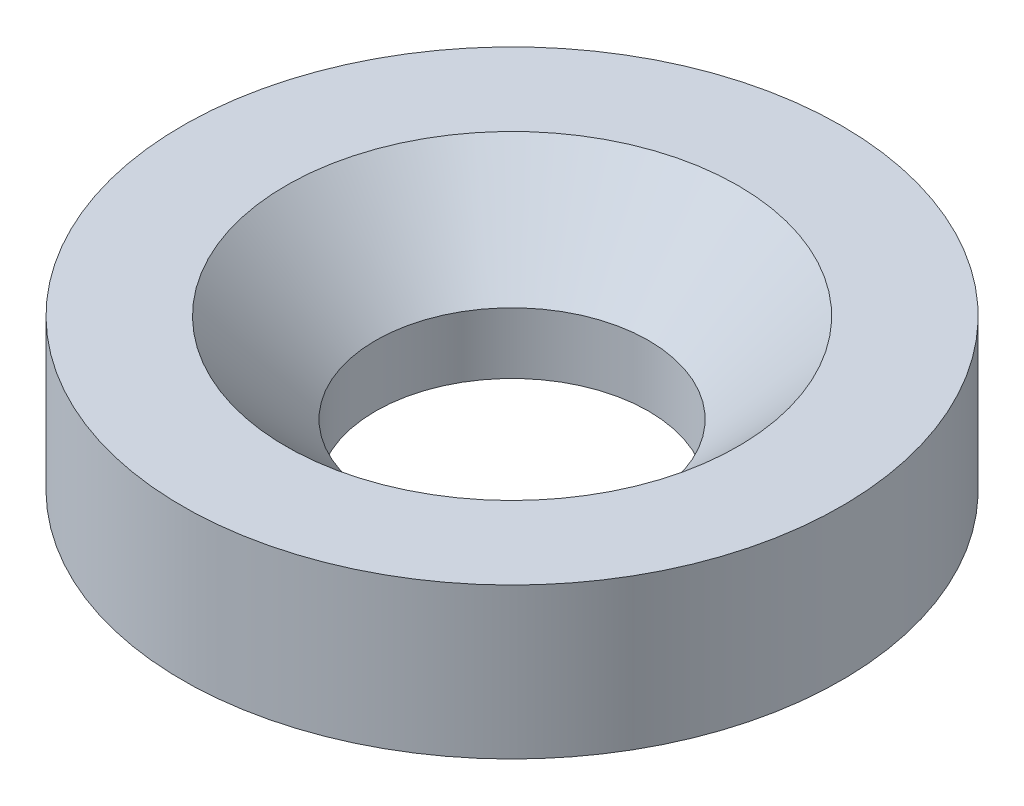
ISO-10303-21;
HEADER;
FILE_DESCRIPTION(('STEP AP214'),'2;1');
FILE_NAME('part.step','',(''),(''),'','','');
FILE_SCHEMA(('AUTOMOTIVE_DESIGN { 1 0 10303 214 1 1 1 1 }'));
ENDSEC;
DATA;
#1=APPLICATION_CONTEXT('core data for automotive mechanical design processes');
#2=APPLICATION_PROTOCOL_DEFINITION('international standard','automotive_design',2000,#1);
#3=PRODUCT_CONTEXT('',#1,'mechanical');
#4=PRODUCT('Part','Part','',(#3));
#5=PRODUCT_RELATED_PRODUCT_CATEGORY('part','',(#4));
#6=PRODUCT_DEFINITION_FORMATION('','',#4);
#7=PRODUCT_DEFINITION_CONTEXT('part definition',#1,'design');
#8=PRODUCT_DEFINITION('design','',#6,#7);
#9=PRODUCT_DEFINITION_SHAPE('','',#8);
#10=(LENGTH_UNIT() NAMED_UNIT(*) SI_UNIT(.MILLI.,.METRE.));
#11=(NAMED_UNIT(*) PLANE_ANGLE_UNIT() SI_UNIT($,.RADIAN.));
#12=(NAMED_UNIT(*) SI_UNIT($,.STERADIAN.) SOLID_ANGLE_UNIT());
#13=UNCERTAINTY_MEASURE_WITH_UNIT(LENGTH_MEASURE(1.E-05),#10,'distance_accuracy_value','');
#14=(GEOMETRIC_REPRESENTATION_CONTEXT(3) GLOBAL_UNCERTAINTY_ASSIGNED_CONTEXT((#13)) GLOBAL_UNIT_ASSIGNED_CONTEXT((#10,
#11,#12)) REPRESENTATION_CONTEXT('',''));
#15=CARTESIAN_POINT('',(0.,0.,0.));
#16=DIRECTION('',(0.,0.,1.));
#17=DIRECTION('',(1.,0.,0.));
#18=AXIS2_PLACEMENT_3D('',#15,#16,#17);
#19=CARTESIAN_POINT('',(0.,0.,0.));
#20=DIRECTION('',(0.,-1.,0.));
#21=DIRECTION('',(0.,0.,-1.));
#22=AXIS2_PLACEMENT_3D('',#19,#20,#21);
#23=CYLINDRICAL_SURFACE('',#22,7.25);
#24=CARTESIAN_POINT('',(0.,0.,0.));
#25=DIRECTION('',(0.,-1.,0.));
#26=DIRECTION('',(0.,0.,-1.));
#27=AXIS2_PLACEMENT_3D('',#24,#25,#26);
#28=CIRCLE('',#27,7.25);
#29=CARTESIAN_POINT('',(0.,0.,-7.25));
#30=VERTEX_POINT('',#29);
#31=EDGE_CURVE('E10',#30,#30,#28,.T.);
#32=ORIENTED_EDGE('',*,*,#31,.T.);
#33=EDGE_LOOP('',(#32));
#34=FACE_BOUND('',#33,.T.);
#35=CARTESIAN_POINT('',(0.,3.24999999999995,0.));
#36=DIRECTION('',(0.,-1.,0.));
#37=DIRECTION('',(0.,0.,-1.));
#38=AXIS2_PLACEMENT_3D('',#35,#36,#37);
#39=CIRCLE('',#38,7.25);
#40=CARTESIAN_POINT('',(0.,3.24999999999995,-7.25));
#41=VERTEX_POINT('',#40);
#42=EDGE_CURVE('E60',#41,#41,#39,.T.);
#43=ORIENTED_EDGE('',*,*,#42,.F.);
#44=EDGE_LOOP('',(#43));
#45=FACE_BOUND('',#44,.T.);
#46=ADVANCED_FACE('F37',(#34,#45),#23,.F.);
#47=CARTESIAN_POINT('',(7.25,0.,0.));
#48=DIRECTION('',(0.,-1.,0.));
#49=DIRECTION('',(0.,0.,-1.));
#50=AXIS2_PLACEMENT_3D('',#47,#48,#49);
#51=PLANE('',#50);
#52=CARTESIAN_POINT('',(0.,0.,0.));
#53=DIRECTION('',(0.,-1.,0.));
#54=DIRECTION('',(0.,0.,-1.));
#55=AXIS2_PLACEMENT_3D('',#52,#53,#54);
#56=CIRCLE('',#55,17.5);
#57=CARTESIAN_POINT('',(0.,0.,-17.5));
#58=VERTEX_POINT('',#57);
#59=EDGE_CURVE('E44',#58,#58,#56,.T.);
#60=ORIENTED_EDGE('',*,*,#59,.T.);
#61=EDGE_LOOP('',(#60));
#62=FACE_BOUND('',#61,.T.);
#63=ORIENTED_EDGE('',*,*,#31,.F.);
#64=EDGE_LOOP('',(#63));
#65=FACE_BOUND('',#64,.T.);
#66=ADVANCED_FACE('F69',(#62,#65),#51,.T.);
#67=CARTESIAN_POINT('',(0.,0.,0.));
#68=DIRECTION('',(0.,-1.,0.));
#69=DIRECTION('',(0.,0.,-1.));
#70=AXIS2_PLACEMENT_3D('',#67,#68,#69);
#71=CYLINDRICAL_SURFACE('',#70,17.5);
#72=CARTESIAN_POINT('',(0.,8.,0.));
#73=DIRECTION('',(0.,-1.,0.));
#74=DIRECTION('',(0.,0.,-1.));
#75=AXIS2_PLACEMENT_3D('',#72,#73,#74);
#76=CIRCLE('',#75,17.5);
#77=CARTESIAN_POINT('',(0.,8.,-17.5));
#78=VERTEX_POINT('',#77);
#79=EDGE_CURVE('E49',#78,#78,#76,.T.);
#80=ORIENTED_EDGE('',*,*,#79,.T.);
#81=EDGE_LOOP('',(#80));
#82=FACE_BOUND('',#81,.T.);
#83=ORIENTED_EDGE('',*,*,#59,.F.);
#84=EDGE_LOOP('',(#83));
#85=FACE_BOUND('',#84,.T.);
#86=ADVANCED_FACE('F73',(#82,#85),#71,.T.);
#87=CARTESIAN_POINT('',(17.5,8.,0.));
#88=DIRECTION('',(0.,1.,0.));
#89=DIRECTION('',(0.,0.,1.));
#90=AXIS2_PLACEMENT_3D('',#87,#88,#89);
#91=PLANE('',#90);
#92=CARTESIAN_POINT('',(0.,8.,0.));
#93=DIRECTION('',(0.,-1.,0.));
#94=DIRECTION('',(0.,0.,-1.));
#95=AXIS2_PLACEMENT_3D('',#92,#93,#94);
#96=CIRCLE('',#95,12.);
#97=CARTESIAN_POINT('',(0.,8.,-12.));
#98=VERTEX_POINT('',#97);
#99=EDGE_CURVE('E54',#98,#98,#96,.T.);
#100=ORIENTED_EDGE('',*,*,#99,.T.);
#101=EDGE_LOOP('',(#100));
#102=FACE_BOUND('',#101,.T.);
#103=ORIENTED_EDGE('',*,*,#79,.F.);
#104=EDGE_LOOP('',(#103));
#105=FACE_BOUND('',#104,.T.);
#106=ADVANCED_FACE('F77',(#102,#105),#91,.T.);
#107=CARTESIAN_POINT('',(0.,8.,0.));
#108=DIRECTION('',(0.,1.,0.));
#109=DIRECTION('',(0.,0.,1.));
#110=AXIS2_PLACEMENT_3D('',#107,#108,#109);
#111=CONICAL_SURFACE('',#110,12.,0.785398163397443);
#112=ORIENTED_EDGE('',*,*,#42,.T.);
#113=EDGE_LOOP('',(#112));
#114=FACE_BOUND('',#113,.T.);
#115=ORIENTED_EDGE('',*,*,#99,.F.);
#116=EDGE_LOOP('',(#115));
#117=FACE_BOUND('',#116,.T.);
#118=ADVANCED_FACE('F65',(#114,#117),#111,.F.);
#119=CLOSED_SHELL('',(#46,#66,#86,#106,#118));
#120=MANIFOLD_SOLID_BREP('B2',#119);
#121=ADVANCED_BREP_SHAPE_REPRESENTATION('',(#18,#120),#14);
#122=SHAPE_DEFINITION_REPRESENTATION(#9,#121);
ENDSEC;
END-ISO-10303-21;
